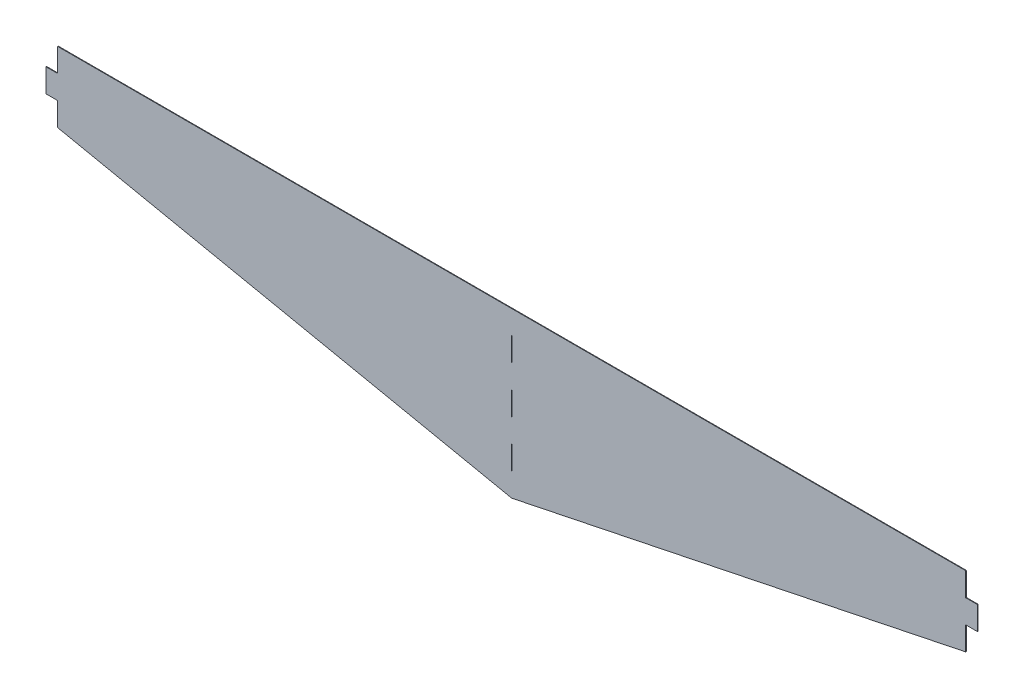
ISO-10303-21;
HEADER;
FILE_DESCRIPTION(('STEP AP214'),'2;1');
FILE_NAME('part.step','',(''),(''),'','','');
FILE_SCHEMA(('AUTOMOTIVE_DESIGN { 1 0 10303 214 1 1 1 1 }'));
ENDSEC;
DATA;
#1=APPLICATION_CONTEXT('core data for automotive mechanical design processes');
#2=APPLICATION_PROTOCOL_DEFINITION('international standard','automotive_design',2000,#1);
#3=PRODUCT_CONTEXT('',#1,'mechanical');
#4=PRODUCT('Part','Part','',(#3));
#5=PRODUCT_RELATED_PRODUCT_CATEGORY('part','',(#4));
#6=PRODUCT_DEFINITION_FORMATION('','',#4);
#7=PRODUCT_DEFINITION_CONTEXT('part definition',#1,'design');
#8=PRODUCT_DEFINITION('design','',#6,#7);
#9=PRODUCT_DEFINITION_SHAPE('','',#8);
#10=(LENGTH_UNIT() NAMED_UNIT(*) SI_UNIT(.MILLI.,.METRE.));
#11=(NAMED_UNIT(*) PLANE_ANGLE_UNIT() SI_UNIT($,.RADIAN.));
#12=(NAMED_UNIT(*) SI_UNIT($,.STERADIAN.) SOLID_ANGLE_UNIT());
#13=UNCERTAINTY_MEASURE_WITH_UNIT(LENGTH_MEASURE(1.E-05),#10,'distance_accuracy_value','');
#14=(GEOMETRIC_REPRESENTATION_CONTEXT(3) GLOBAL_UNCERTAINTY_ASSIGNED_CONTEXT((#13)) GLOBAL_UNIT_ASSIGNED_CONTEXT((#10,
#11,#12)) REPRESENTATION_CONTEXT('',''));
#15=CARTESIAN_POINT('',(0.,0.,0.));
#16=DIRECTION('',(0.,0.,1.));
#17=DIRECTION('',(1.,0.,0.));
#18=AXIS2_PLACEMENT_3D('',#15,#16,#17);
#19=CARTESIAN_POINT('',(-198.5,40.,0.125));
#20=DIRECTION('',(1.,0.,0.));
#21=DIRECTION('',(0.,0.,-1.));
#22=AXIS2_PLACEMENT_3D('',#19,#20,#21);
#23=PLANE('',#22);
#24=DIRECTION('',(0.,-1.,0.));
#25=VECTOR('',#24,1.);
#26=CARTESIAN_POINT('',(-198.5,40.,-0.125));
#27=LINE('',#26,#25);
#28=CARTESIAN_POINT('',(-198.5,60.,-0.125));
#29=VERTEX_POINT('',#28);
#30=CARTESIAN_POINT('',(-198.5,50.,-0.125));
#31=VERTEX_POINT('',#30);
#32=EDGE_CURVE('E219',#29,#31,#27,.T.);
#33=ORIENTED_EDGE('',*,*,#32,.T.);
#34=DIRECTION('',(0.,0.,1.));
#35=VECTOR('',#34,1.);
#36=CARTESIAN_POINT('',(-198.5,50.,-0.125));
#37=LINE('',#36,#35);
#38=CARTESIAN_POINT('',(-198.5,50.,0.125));
#39=VERTEX_POINT('',#38);
#40=EDGE_CURVE('E381',#31,#39,#37,.T.);
#41=ORIENTED_EDGE('',*,*,#40,.T.);
#42=DIRECTION('',(0.,-1.,0.));
#43=VECTOR('',#42,1.);
#44=CARTESIAN_POINT('',(-198.5,40.,0.125));
#45=LINE('',#44,#43);
#46=CARTESIAN_POINT('',(-198.5,60.,0.125));
#47=VERTEX_POINT('',#46);
#48=EDGE_CURVE('E231',#47,#39,#45,.T.);
#49=ORIENTED_EDGE('',*,*,#48,.F.);
#50=DIRECTION('',(0.,0.,1.));
#51=VECTOR('',#50,1.);
#52=CARTESIAN_POINT('',(-198.5,60.,-0.125));
#53=LINE('',#52,#51);
#54=EDGE_CURVE('E278',#29,#47,#53,.T.);
#55=ORIENTED_EDGE('',*,*,#54,.F.);
#56=EDGE_LOOP('',(#33,#41,#49,#55));
#57=FACE_BOUND('',#56,.T.);
#58=ADVANCED_FACE('F33',(#57),#23,.F.);
#59=CARTESIAN_POINT('',(0.,0.,0.125));
#60=DIRECTION('',(0.202438249047063,0.979295029765167,0.));
#61=DIRECTION('',(-0.979295029765167,0.202438249047063,0.));
#62=AXIS2_PLACEMENT_3D('',#59,#60,#61);
#63=PLANE('',#62);
#64=DIRECTION('',(0.979295029765167,-0.202438249047063,0.));
#65=VECTOR('',#64,1.);
#66=CARTESIAN_POINT('',(0.,0.,-0.125));
#67=LINE('',#66,#65);
#68=CARTESIAN_POINT('',(-193.5,40.,-0.125));
#69=VERTEX_POINT('',#68);
#70=CARTESIAN_POINT('',(0.,0.,-0.125));
#71=VERTEX_POINT('',#70);
#72=EDGE_CURVE('E211',#69,#71,#67,.T.);
#73=ORIENTED_EDGE('',*,*,#72,.T.);
#74=DIRECTION('',(0.,0.,-1.));
#75=VECTOR('',#74,1.);
#76=CARTESIAN_POINT('',(0.,0.,0.125));
#77=LINE('',#76,#75);
#78=CARTESIAN_POINT('',(0.,0.,0.125));
#79=VERTEX_POINT('',#78);
#80=EDGE_CURVE('E40',#79,#71,#77,.T.);
#81=ORIENTED_EDGE('',*,*,#80,.F.);
#82=DIRECTION('',(0.979295029765167,-0.202438249047063,0.));
#83=VECTOR('',#82,1.);
#84=CARTESIAN_POINT('',(0.,0.,0.125));
#85=LINE('',#84,#83);
#86=CARTESIAN_POINT('',(-193.5,40.,0.125));
#87=VERTEX_POINT('',#86);
#88=EDGE_CURVE('E213',#87,#79,#85,.T.);
#89=ORIENTED_EDGE('',*,*,#88,.F.);
#90=DIRECTION('',(0.,0.,-1.));
#91=VECTOR('',#90,1.);
#92=CARTESIAN_POINT('',(-193.5,40.,0.125));
#93=LINE('',#92,#91);
#94=EDGE_CURVE('E11',#87,#69,#93,.T.);
#95=ORIENTED_EDGE('',*,*,#94,.T.);
#96=EDGE_LOOP('',(#73,#81,#89,#95));
#97=FACE_BOUND('',#96,.T.);
#98=ADVANCED_FACE('F209',(#97),#63,.F.);
#99=CARTESIAN_POINT('',(0.,0.,0.125));
#100=DIRECTION('',(-0.202438249047063,0.979295029765167,0.));
#101=DIRECTION('',(-0.979295029765167,-0.202438249047063,0.));
#102=AXIS2_PLACEMENT_3D('',#99,#100,#101);
#103=PLANE('',#102);
#104=DIRECTION('',(0.979295029765167,0.202438249047063,0.));
#105=VECTOR('',#104,1.);
#106=CARTESIAN_POINT('',(0.,0.,-0.125));
#107=LINE('',#106,#105);
#108=CARTESIAN_POINT('',(193.5,40.,-0.125));
#109=VERTEX_POINT('',#108);
#110=EDGE_CURVE('E218',#71,#109,#107,.T.);
#111=ORIENTED_EDGE('',*,*,#110,.T.);
#112=DIRECTION('',(0.,0.,-1.));
#113=VECTOR('',#112,1.);
#114=CARTESIAN_POINT('',(193.5,40.,0.125));
#115=LINE('',#114,#113);
#116=CARTESIAN_POINT('',(193.5,40.,0.125));
#117=VERTEX_POINT('',#116);
#118=EDGE_CURVE('E232',#117,#109,#115,.T.);
#119=ORIENTED_EDGE('',*,*,#118,.F.);
#120=DIRECTION('',(0.979295029765167,0.202438249047063,0.));
#121=VECTOR('',#120,1.);
#122=CARTESIAN_POINT('',(0.,0.,0.125));
#123=LINE('',#122,#121);
#124=EDGE_CURVE('E239',#79,#117,#123,.T.);
#125=ORIENTED_EDGE('',*,*,#124,.F.);
#126=ORIENTED_EDGE('',*,*,#80,.T.);
#127=EDGE_LOOP('',(#111,#119,#125,#126));
#128=FACE_BOUND('',#127,.T.);
#129=ADVANCED_FACE('F236',(#128),#103,.F.);
#130=CARTESIAN_POINT('',(198.5,40.,0.125));
#131=DIRECTION('',(-1.,0.,0.));
#132=DIRECTION('',(0.,0.,1.));
#133=AXIS2_PLACEMENT_3D('',#130,#131,#132);
#134=PLANE('',#133);
#135=DIRECTION('',(0.,1.,0.));
#136=VECTOR('',#135,1.);
#137=CARTESIAN_POINT('',(198.5,40.,0.125));
#138=LINE('',#137,#136);
#139=CARTESIAN_POINT('',(198.5,50.,0.125));
#140=VERTEX_POINT('',#139);
#141=CARTESIAN_POINT('',(198.5,60.,0.125));
#142=VERTEX_POINT('',#141);
#143=EDGE_CURVE('E242',#140,#142,#138,.T.);
#144=ORIENTED_EDGE('',*,*,#143,.F.);
#145=DIRECTION('',(0.,0.,1.));
#146=VECTOR('',#145,1.);
#147=CARTESIAN_POINT('',(198.5,50.,-0.125));
#148=LINE('',#147,#146);
#149=CARTESIAN_POINT('',(198.5,50.,-0.125));
#150=VERTEX_POINT('',#149);
#151=EDGE_CURVE('E394',#150,#140,#148,.T.);
#152=ORIENTED_EDGE('',*,*,#151,.F.);
#153=DIRECTION('',(0.,1.,0.));
#154=VECTOR('',#153,1.);
#155=CARTESIAN_POINT('',(198.5,40.,-0.125));
#156=LINE('',#155,#154);
#157=CARTESIAN_POINT('',(198.5,60.,-0.125));
#158=VERTEX_POINT('',#157);
#159=EDGE_CURVE('E221',#150,#158,#156,.T.);
#160=ORIENTED_EDGE('',*,*,#159,.T.);
#161=DIRECTION('',(0.,0.,1.));
#162=VECTOR('',#161,1.);
#163=CARTESIAN_POINT('',(198.5,60.,-0.125));
#164=LINE('',#163,#162);
#165=EDGE_CURVE('E414',#158,#142,#164,.T.);
#166=ORIENTED_EDGE('',*,*,#165,.T.);
#167=EDGE_LOOP('',(#144,#152,#160,#166));
#168=FACE_BOUND('',#167,.T.);
#169=ADVANCED_FACE('F442',(#168),#134,.F.);
#170=CARTESIAN_POINT('',(-198.5,70.,0.125));
#171=DIRECTION('',(0.,-1.,0.));
#172=DIRECTION('',(1.,0.,0.));
#173=AXIS2_PLACEMENT_3D('',#170,#171,#172);
#174=PLANE('',#173);
#175=DIRECTION('',(-1.,0.,0.));
#176=VECTOR('',#175,1.);
#177=CARTESIAN_POINT('',(198.5,70.,0.125));
#178=LINE('',#177,#176);
#179=CARTESIAN_POINT('',(193.5,70.,0.125));
#180=VERTEX_POINT('',#179);
#181=CARTESIAN_POINT('',(-193.5,70.,0.125));
#182=VERTEX_POINT('',#181);
#183=EDGE_CURVE('E233',#180,#182,#178,.T.);
#184=ORIENTED_EDGE('',*,*,#183,.F.);
#185=DIRECTION('',(0.,0.,1.));
#186=VECTOR('',#185,1.);
#187=CARTESIAN_POINT('',(193.5,70.,-0.125));
#188=LINE('',#187,#186);
#189=CARTESIAN_POINT('',(193.5,70.,-0.125));
#190=VERTEX_POINT('',#189);
#191=EDGE_CURVE('E412',#190,#180,#188,.T.);
#192=ORIENTED_EDGE('',*,*,#191,.F.);
#193=DIRECTION('',(-1.,0.,0.));
#194=VECTOR('',#193,1.);
#195=CARTESIAN_POINT('',(-198.5,70.,-0.125));
#196=LINE('',#195,#194);
#197=CARTESIAN_POINT('',(-193.5,70.,-0.125));
#198=VERTEX_POINT('',#197);
#199=EDGE_CURVE('E229',#190,#198,#196,.T.);
#200=ORIENTED_EDGE('',*,*,#199,.T.);
#201=DIRECTION('',(0.,0.,1.));
#202=VECTOR('',#201,1.);
#203=CARTESIAN_POINT('',(-193.5,70.,-0.125));
#204=LINE('',#203,#202);
#205=EDGE_CURVE('E264',#198,#182,#204,.T.);
#206=ORIENTED_EDGE('',*,*,#205,.T.);
#207=EDGE_LOOP('',(#184,#192,#200,#206));
#208=FACE_BOUND('',#207,.T.);
#209=ADVANCED_FACE('F272',(#208),#174,.F.);
#210=CARTESIAN_POINT('',(0.,0.,0.125));
#211=DIRECTION('',(0.,0.,-1.));
#212=DIRECTION('',(-1.,0.,0.));
#213=AXIS2_PLACEMENT_3D('',#210,#211,#212);
#214=PLANE('',#213);
#215=DIRECTION('',(-1.,0.,0.));
#216=VECTOR('',#215,1.);
#217=CARTESIAN_POINT('',(-0.149999999999997,20.,0.125));
#218=LINE('',#217,#216);
#219=CARTESIAN_POINT('',(0.150000000000003,20.,0.125));
#220=VERTEX_POINT('',#219);
#221=CARTESIAN_POINT('',(-0.149999999999997,20.,0.125));
#222=VERTEX_POINT('',#221);
#223=EDGE_CURVE('E276',#220,#222,#218,.T.);
#224=ORIENTED_EDGE('',*,*,#223,.F.);
#225=DIRECTION('',(0.,1.,0.));
#226=VECTOR('',#225,1.);
#227=CARTESIAN_POINT('',(0.150000000000003,20.,0.125));
#228=LINE('',#227,#226);
#229=CARTESIAN_POINT('',(0.150000000000004,10.,0.125));
#230=VERTEX_POINT('',#229);
#231=EDGE_CURVE('E274',#230,#220,#228,.T.);
#232=ORIENTED_EDGE('',*,*,#231,.F.);
#233=DIRECTION('',(1.,0.,0.));
#234=VECTOR('',#233,1.);
#235=CARTESIAN_POINT('',(-0.149999999999996,10.,0.125));
#236=LINE('',#235,#234);
#237=CARTESIAN_POINT('',(-0.149999999999996,10.,0.125));
#238=VERTEX_POINT('',#237);
#239=EDGE_CURVE('E288',#238,#230,#236,.T.);
#240=ORIENTED_EDGE('',*,*,#239,.F.);
#241=DIRECTION('',(0.,-1.,0.));
#242=VECTOR('',#241,1.);
#243=CARTESIAN_POINT('',(-0.149999999999997,20.,0.125));
#244=LINE('',#243,#242);
#245=EDGE_CURVE('E300',#222,#238,#244,.T.);
#246=ORIENTED_EDGE('',*,*,#245,.F.);
#247=EDGE_LOOP('',(#224,#232,#240,#246));
#248=FACE_BOUND('',#247,.T.);
#249=DIRECTION('',(-1.,0.,0.));
#250=VECTOR('',#249,1.);
#251=CARTESIAN_POINT('',(-0.15,40.,0.125));
#252=LINE('',#251,#250);
#253=CARTESIAN_POINT('',(0.15,40.,0.125));
#254=VERTEX_POINT('',#253);
#255=CARTESIAN_POINT('',(-0.15,40.,0.125));
#256=VERTEX_POINT('',#255);
#257=EDGE_CURVE('E329',#254,#256,#252,.T.);
#258=ORIENTED_EDGE('',*,*,#257,.F.);
#259=DIRECTION('',(0.,1.,0.));
#260=VECTOR('',#259,1.);
#261=CARTESIAN_POINT('',(0.15,40.,0.125));
#262=LINE('',#261,#260);
#263=CARTESIAN_POINT('',(0.150000000000002,30.,0.125));
#264=VERTEX_POINT('',#263);
#265=EDGE_CURVE('E307',#264,#254,#262,.T.);
#266=ORIENTED_EDGE('',*,*,#265,.F.);
#267=DIRECTION('',(1.,0.,0.));
#268=VECTOR('',#267,1.);
#269=CARTESIAN_POINT('',(-0.149999999999998,30.,0.125));
#270=LINE('',#269,#268);
#271=CARTESIAN_POINT('',(-0.149999999999998,30.,0.125));
#272=VERTEX_POINT('',#271);
#273=EDGE_CURVE('E318',#272,#264,#270,.T.);
#274=ORIENTED_EDGE('',*,*,#273,.F.);
#275=DIRECTION('',(0.,-1.,0.));
#276=VECTOR('',#275,1.);
#277=CARTESIAN_POINT('',(-0.15,40.,0.125));
#278=LINE('',#277,#276);
#279=EDGE_CURVE('E332',#256,#272,#278,.T.);
#280=ORIENTED_EDGE('',*,*,#279,.F.);
#281=EDGE_LOOP('',(#258,#266,#274,#280));
#282=FACE_BOUND('',#281,.T.);
#283=DIRECTION('',(-1.,0.,0.));
#284=VECTOR('',#283,1.);
#285=CARTESIAN_POINT('',(-0.150000000000002,60.,0.125));
#286=LINE('',#285,#284);
#287=CARTESIAN_POINT('',(0.149999999999998,60.,0.125));
#288=VERTEX_POINT('',#287);
#289=CARTESIAN_POINT('',(-0.150000000000002,60.,0.125));
#290=VERTEX_POINT('',#289);
#291=EDGE_CURVE('E361',#288,#290,#286,.T.);
#292=ORIENTED_EDGE('',*,*,#291,.F.);
#293=DIRECTION('',(0.,1.,0.));
#294=VECTOR('',#293,1.);
#295=CARTESIAN_POINT('',(0.149999999999998,60.,0.125));
#296=LINE('',#295,#294);
#297=CARTESIAN_POINT('',(0.149999999999999,50.,0.125));
#298=VERTEX_POINT('',#297);
#299=EDGE_CURVE('E339',#298,#288,#296,.T.);
#300=ORIENTED_EDGE('',*,*,#299,.F.);
#301=DIRECTION('',(1.,0.,0.));
#302=VECTOR('',#301,1.);
#303=CARTESIAN_POINT('',(-0.150000000000001,50.,0.125));
#304=LINE('',#303,#302);
#305=CARTESIAN_POINT('',(-0.150000000000001,50.,0.125));
#306=VERTEX_POINT('',#305);
#307=EDGE_CURVE('E350',#306,#298,#304,.T.);
#308=ORIENTED_EDGE('',*,*,#307,.F.);
#309=DIRECTION('',(0.,-1.,0.));
#310=VECTOR('',#309,1.);
#311=CARTESIAN_POINT('',(-0.150000000000002,60.,0.125));
#312=LINE('',#311,#310);
#313=EDGE_CURVE('E364',#290,#306,#312,.T.);
#314=ORIENTED_EDGE('',*,*,#313,.F.);
#315=EDGE_LOOP('',(#292,#300,#308,#314));
#316=FACE_BOUND('',#315,.T.);
#317=ORIENTED_EDGE('',*,*,#48,.T.);
#318=DIRECTION('',(-1.,0.,0.));
#319=VECTOR('',#318,1.);
#320=CARTESIAN_POINT('',(-198.5,50.,0.125));
#321=LINE('',#320,#319);
#322=CARTESIAN_POINT('',(-193.5,50.,0.125));
#323=VERTEX_POINT('',#322);
#324=EDGE_CURVE('E205',#323,#39,#321,.T.);
#325=ORIENTED_EDGE('',*,*,#324,.F.);
#326=DIRECTION('',(0.,1.,0.));
#327=VECTOR('',#326,1.);
#328=CARTESIAN_POINT('',(-193.5,50.,0.125));
#329=LINE('',#328,#327);
#330=EDGE_CURVE('E401',#87,#323,#329,.T.);
#331=ORIENTED_EDGE('',*,*,#330,.F.);
#332=ORIENTED_EDGE('',*,*,#88,.T.);
#333=ORIENTED_EDGE('',*,*,#124,.T.);
#334=DIRECTION('',(0.,-1.,0.));
#335=VECTOR('',#334,1.);
#336=CARTESIAN_POINT('',(193.5,50.,0.125));
#337=LINE('',#336,#335);
#338=CARTESIAN_POINT('',(193.5,50.,0.125));
#339=VERTEX_POINT('',#338);
#340=EDGE_CURVE('E395',#339,#117,#337,.T.);
#341=ORIENTED_EDGE('',*,*,#340,.F.);
#342=DIRECTION('',(-1.,0.,0.));
#343=VECTOR('',#342,1.);
#344=CARTESIAN_POINT('',(193.5,50.,0.125));
#345=LINE('',#344,#343);
#346=EDGE_CURVE('E391',#140,#339,#345,.T.);
#347=ORIENTED_EDGE('',*,*,#346,.F.);
#348=ORIENTED_EDGE('',*,*,#143,.T.);
#349=DIRECTION('',(1.,0.,0.));
#350=VECTOR('',#349,1.);
#351=CARTESIAN_POINT('',(193.5,60.,0.125));
#352=LINE('',#351,#350);
#353=CARTESIAN_POINT('',(193.5,60.,0.125));
#354=VERTEX_POINT('',#353);
#355=EDGE_CURVE('E383',#354,#142,#352,.T.);
#356=ORIENTED_EDGE('',*,*,#355,.F.);
#357=DIRECTION('',(0.,-1.,0.));
#358=VECTOR('',#357,1.);
#359=CARTESIAN_POINT('',(193.5,70.,0.125));
#360=LINE('',#359,#358);
#361=EDGE_CURVE('E257',#180,#354,#360,.T.);
#362=ORIENTED_EDGE('',*,*,#361,.F.);
#363=ORIENTED_EDGE('',*,*,#183,.T.);
#364=DIRECTION('',(0.,1.,0.));
#365=VECTOR('',#364,1.);
#366=CARTESIAN_POINT('',(-193.5,70.,0.125));
#367=LINE('',#366,#365);
#368=CARTESIAN_POINT('',(-193.5,60.,0.125));
#369=VERTEX_POINT('',#368);
#370=EDGE_CURVE('E254',#369,#182,#367,.T.);
#371=ORIENTED_EDGE('',*,*,#370,.F.);
#372=DIRECTION('',(1.,0.,0.));
#373=VECTOR('',#372,1.);
#374=CARTESIAN_POINT('',(-198.5,60.,0.125));
#375=LINE('',#374,#373);
#376=EDGE_CURVE('E270',#47,#369,#375,.T.);
#377=ORIENTED_EDGE('',*,*,#376,.F.);
#378=EDGE_LOOP('',(#317,#325,#331,#332,#333,#341,#347,#348,#356,#362,#363,#371,#377));
#379=FACE_BOUND('',#378,.T.);
#380=ADVANCED_FACE('F252',(#248,#282,#316,#379),#214,.F.);
#381=CARTESIAN_POINT('',(0.,0.,-0.125));
#382=DIRECTION('',(0.,0.,-1.));
#383=DIRECTION('',(-1.,0.,0.));
#384=AXIS2_PLACEMENT_3D('',#381,#382,#383);
#385=PLANE('',#384);
#386=DIRECTION('',(-1.,0.,0.));
#387=VECTOR('',#386,1.);
#388=CARTESIAN_POINT('',(-198.5,50.,-0.125));
#389=LINE('',#388,#387);
#390=CARTESIAN_POINT('',(-193.5,50.,-0.125));
#391=VERTEX_POINT('',#390);
#392=EDGE_CURVE('E47',#391,#31,#389,.T.);
#393=ORIENTED_EDGE('',*,*,#392,.T.);
#394=ORIENTED_EDGE('',*,*,#32,.F.);
#395=DIRECTION('',(1.,0.,0.));
#396=VECTOR('',#395,1.);
#397=CARTESIAN_POINT('',(-198.5,60.,-0.125));
#398=LINE('',#397,#396);
#399=CARTESIAN_POINT('',(-193.5,60.,-0.125));
#400=VERTEX_POINT('',#399);
#401=EDGE_CURVE('E269',#29,#400,#398,.T.);
#402=ORIENTED_EDGE('',*,*,#401,.T.);
#403=DIRECTION('',(0.,1.,0.));
#404=VECTOR('',#403,1.);
#405=CARTESIAN_POINT('',(-193.5,70.,-0.125));
#406=LINE('',#405,#404);
#407=EDGE_CURVE('E283',#400,#198,#406,.T.);
#408=ORIENTED_EDGE('',*,*,#407,.T.);
#409=ORIENTED_EDGE('',*,*,#199,.F.);
#410=DIRECTION('',(0.,-1.,0.));
#411=VECTOR('',#410,1.);
#412=CARTESIAN_POINT('',(193.5,70.,-0.125));
#413=LINE('',#412,#411);
#414=CARTESIAN_POINT('',(193.5,60.,-0.125));
#415=VERTEX_POINT('',#414);
#416=EDGE_CURVE('E403',#190,#415,#413,.T.);
#417=ORIENTED_EDGE('',*,*,#416,.T.);
#418=DIRECTION('',(1.,0.,0.));
#419=VECTOR('',#418,1.);
#420=CARTESIAN_POINT('',(193.5,60.,-0.125));
#421=LINE('',#420,#419);
#422=EDGE_CURVE('E406',#415,#158,#421,.T.);
#423=ORIENTED_EDGE('',*,*,#422,.T.);
#424=ORIENTED_EDGE('',*,*,#159,.F.);
#425=DIRECTION('',(-1.,0.,0.));
#426=VECTOR('',#425,1.);
#427=CARTESIAN_POINT('',(193.5,50.,-0.125));
#428=LINE('',#427,#426);
#429=CARTESIAN_POINT('',(193.5,50.,-0.125));
#430=VERTEX_POINT('',#429);
#431=EDGE_CURVE('E390',#150,#430,#428,.T.);
#432=ORIENTED_EDGE('',*,*,#431,.T.);
#433=DIRECTION('',(0.,-1.,0.));
#434=VECTOR('',#433,1.);
#435=CARTESIAN_POINT('',(193.5,50.,-0.125));
#436=LINE('',#435,#434);
#437=EDGE_CURVE('E55',#430,#109,#436,.T.);
#438=ORIENTED_EDGE('',*,*,#437,.T.);
#439=ORIENTED_EDGE('',*,*,#110,.F.);
#440=ORIENTED_EDGE('',*,*,#72,.F.);
#441=DIRECTION('',(0.,1.,0.));
#442=VECTOR('',#441,1.);
#443=CARTESIAN_POINT('',(-193.5,50.,-0.125));
#444=LINE('',#443,#442);
#445=EDGE_CURVE('E198',#69,#391,#444,.T.);
#446=ORIENTED_EDGE('',*,*,#445,.T.);
#447=EDGE_LOOP('',(#393,#394,#402,#408,#409,#417,#423,#424,#432,#438,#439,#440,#446));
#448=FACE_BOUND('',#447,.T.);
#449=DIRECTION('',(0.,1.,0.));
#450=VECTOR('',#449,1.);
#451=CARTESIAN_POINT('',(0.150000000000003,20.,-0.125));
#452=LINE('',#451,#450);
#453=CARTESIAN_POINT('',(0.150000000000004,10.,-0.125));
#454=VERTEX_POINT('',#453);
#455=CARTESIAN_POINT('',(0.150000000000003,20.,-0.125));
#456=VERTEX_POINT('',#455);
#457=EDGE_CURVE('E284',#454,#456,#452,.T.);
#458=ORIENTED_EDGE('',*,*,#457,.T.);
#459=DIRECTION('',(-1.,0.,0.));
#460=VECTOR('',#459,1.);
#461=CARTESIAN_POINT('',(-0.149999999999997,20.,-0.125));
#462=LINE('',#461,#460);
#463=CARTESIAN_POINT('',(-0.149999999999997,20.,-0.125));
#464=VERTEX_POINT('',#463);
#465=EDGE_CURVE('E287',#456,#464,#462,.T.);
#466=ORIENTED_EDGE('',*,*,#465,.T.);
#467=DIRECTION('',(0.,-1.,0.));
#468=VECTOR('',#467,1.);
#469=CARTESIAN_POINT('',(-0.149999999999997,20.,-0.125));
#470=LINE('',#469,#468);
#471=CARTESIAN_POINT('',(-0.149999999999996,10.,-0.125));
#472=VERTEX_POINT('',#471);
#473=EDGE_CURVE('E291',#464,#472,#470,.T.);
#474=ORIENTED_EDGE('',*,*,#473,.T.);
#475=DIRECTION('',(1.,0.,0.));
#476=VECTOR('',#475,1.);
#477=CARTESIAN_POINT('',(-0.149999999999996,10.,-0.125));
#478=LINE('',#477,#476);
#479=EDGE_CURVE('E294',#472,#454,#478,.T.);
#480=ORIENTED_EDGE('',*,*,#479,.T.);
#481=EDGE_LOOP('',(#458,#466,#474,#480));
#482=FACE_BOUND('',#481,.T.);
#483=DIRECTION('',(0.,1.,0.));
#484=VECTOR('',#483,1.);
#485=CARTESIAN_POINT('',(0.15,40.,-0.125));
#486=LINE('',#485,#484);
#487=CARTESIAN_POINT('',(0.150000000000002,30.,-0.125));
#488=VERTEX_POINT('',#487);
#489=CARTESIAN_POINT('',(0.15,40.,-0.125));
#490=VERTEX_POINT('',#489);
#491=EDGE_CURVE('E314',#488,#490,#486,.T.);
#492=ORIENTED_EDGE('',*,*,#491,.T.);
#493=DIRECTION('',(-1.,0.,0.));
#494=VECTOR('',#493,1.);
#495=CARTESIAN_POINT('',(-0.15,40.,-0.125));
#496=LINE('',#495,#494);
#497=CARTESIAN_POINT('',(-0.15,40.,-0.125));
#498=VERTEX_POINT('',#497);
#499=EDGE_CURVE('E317',#490,#498,#496,.T.);
#500=ORIENTED_EDGE('',*,*,#499,.T.);
#501=DIRECTION('',(0.,-1.,0.));
#502=VECTOR('',#501,1.);
#503=CARTESIAN_POINT('',(-0.15,40.,-0.125));
#504=LINE('',#503,#502);
#505=CARTESIAN_POINT('',(-0.149999999999998,30.,-0.125));
#506=VERTEX_POINT('',#505);
#507=EDGE_CURVE('E321',#498,#506,#504,.T.);
#508=ORIENTED_EDGE('',*,*,#507,.T.);
#509=DIRECTION('',(1.,0.,0.));
#510=VECTOR('',#509,1.);
#511=CARTESIAN_POINT('',(-0.149999999999998,30.,-0.125));
#512=LINE('',#511,#510);
#513=EDGE_CURVE('E324',#506,#488,#512,.T.);
#514=ORIENTED_EDGE('',*,*,#513,.T.);
#515=EDGE_LOOP('',(#492,#500,#508,#514));
#516=FACE_BOUND('',#515,.T.);
#517=DIRECTION('',(0.,1.,0.));
#518=VECTOR('',#517,1.);
#519=CARTESIAN_POINT('',(0.149999999999998,60.,-0.125));
#520=LINE('',#519,#518);
#521=CARTESIAN_POINT('',(0.149999999999999,50.,-0.125));
#522=VERTEX_POINT('',#521);
#523=CARTESIAN_POINT('',(0.149999999999998,60.,-0.125));
#524=VERTEX_POINT('',#523);
#525=EDGE_CURVE('E346',#522,#524,#520,.T.);
#526=ORIENTED_EDGE('',*,*,#525,.T.);
#527=DIRECTION('',(-1.,0.,0.));
#528=VECTOR('',#527,1.);
#529=CARTESIAN_POINT('',(-0.150000000000002,60.,-0.125));
#530=LINE('',#529,#528);
#531=CARTESIAN_POINT('',(-0.150000000000002,60.,-0.125));
#532=VERTEX_POINT('',#531);
#533=EDGE_CURVE('E349',#524,#532,#530,.T.);
#534=ORIENTED_EDGE('',*,*,#533,.T.);
#535=DIRECTION('',(0.,-1.,0.));
#536=VECTOR('',#535,1.);
#537=CARTESIAN_POINT('',(-0.150000000000002,60.,-0.125));
#538=LINE('',#537,#536);
#539=CARTESIAN_POINT('',(-0.150000000000001,50.,-0.125));
#540=VERTEX_POINT('',#539);
#541=EDGE_CURVE('E353',#532,#540,#538,.T.);
#542=ORIENTED_EDGE('',*,*,#541,.T.);
#543=DIRECTION('',(1.,0.,0.));
#544=VECTOR('',#543,1.);
#545=CARTESIAN_POINT('',(-0.150000000000001,50.,-0.125));
#546=LINE('',#545,#544);
#547=EDGE_CURVE('E356',#540,#522,#546,.T.);
#548=ORIENTED_EDGE('',*,*,#547,.T.);
#549=EDGE_LOOP('',(#526,#534,#542,#548));
#550=FACE_BOUND('',#549,.T.);
#551=ADVANCED_FACE('F215',(#448,#482,#516,#550),#385,.T.);
#552=CARTESIAN_POINT('',(0.149999999999998,60.,-0.125));
#553=DIRECTION('',(1.,0.,0.));
#554=DIRECTION('',(0.,1.,0.));
#555=AXIS2_PLACEMENT_3D('',#552,#553,#554);
#556=PLANE('',#555);
#557=ORIENTED_EDGE('',*,*,#299,.T.);
#558=DIRECTION('',(0.,0.,1.));
#559=VECTOR('',#558,1.);
#560=CARTESIAN_POINT('',(0.149999999999998,60.,-0.125));
#561=LINE('',#560,#559);
#562=EDGE_CURVE('E359',#524,#288,#561,.T.);
#563=ORIENTED_EDGE('',*,*,#562,.F.);
#564=ORIENTED_EDGE('',*,*,#525,.F.);
#565=DIRECTION('',(0.,0.,1.));
#566=VECTOR('',#565,1.);
#567=CARTESIAN_POINT('',(0.149999999999999,50.,-0.125));
#568=LINE('',#567,#566);
#569=EDGE_CURVE('E224',#522,#298,#568,.T.);
#570=ORIENTED_EDGE('',*,*,#569,.T.);
#571=EDGE_LOOP('',(#557,#563,#564,#570));
#572=FACE_BOUND('',#571,.T.);
#573=ADVANCED_FACE('F452',(#572),#556,.F.);
#574=CARTESIAN_POINT('',(-0.150000000000001,50.,-0.125));
#575=DIRECTION('',(0.,-1.,0.));
#576=DIRECTION('',(0.,0.,-1.));
#577=AXIS2_PLACEMENT_3D('',#574,#575,#576);
#578=PLANE('',#577);
#579=ORIENTED_EDGE('',*,*,#307,.T.);
#580=ORIENTED_EDGE('',*,*,#569,.F.);
#581=ORIENTED_EDGE('',*,*,#547,.F.);
#582=DIRECTION('',(0.,0.,1.));
#583=VECTOR('',#582,1.);
#584=CARTESIAN_POINT('',(-0.150000000000001,50.,-0.125));
#585=LINE('',#584,#583);
#586=EDGE_CURVE('E370',#540,#306,#585,.T.);
#587=ORIENTED_EDGE('',*,*,#586,.T.);
#588=EDGE_LOOP('',(#579,#580,#581,#587));
#589=FACE_BOUND('',#588,.T.);
#590=ADVANCED_FACE('F458',(#589),#578,.F.);
#591=CARTESIAN_POINT('',(-0.150000000000002,60.,-0.125));
#592=DIRECTION('',(-1.,0.,0.));
#593=DIRECTION('',(0.,-1.,0.));
#594=AXIS2_PLACEMENT_3D('',#591,#592,#593);
#595=PLANE('',#594);
#596=ORIENTED_EDGE('',*,*,#313,.T.);
#597=ORIENTED_EDGE('',*,*,#586,.F.);
#598=ORIENTED_EDGE('',*,*,#541,.F.);
#599=DIRECTION('',(0.,0.,1.));
#600=VECTOR('',#599,1.);
#601=CARTESIAN_POINT('',(-0.150000000000002,60.,-0.125));
#602=LINE('',#601,#600);
#603=EDGE_CURVE('E372',#532,#290,#602,.T.);
#604=ORIENTED_EDGE('',*,*,#603,.T.);
#605=EDGE_LOOP('',(#596,#597,#598,#604));
#606=FACE_BOUND('',#605,.T.);
#607=ADVANCED_FACE('F464',(#606),#595,.F.);
#608=CARTESIAN_POINT('',(-0.150000000000002,60.,-0.125));
#609=DIRECTION('',(0.,1.,0.));
#610=DIRECTION('',(0.,0.,1.));
#611=AXIS2_PLACEMENT_3D('',#608,#609,#610);
#612=PLANE('',#611);
#613=ORIENTED_EDGE('',*,*,#291,.T.);
#614=ORIENTED_EDGE('',*,*,#603,.F.);
#615=ORIENTED_EDGE('',*,*,#533,.F.);
#616=ORIENTED_EDGE('',*,*,#562,.T.);
#617=EDGE_LOOP('',(#613,#614,#615,#616));
#618=FACE_BOUND('',#617,.T.);
#619=ADVANCED_FACE('F460',(#618),#612,.F.);
#620=CARTESIAN_POINT('',(0.15,40.,-0.125));
#621=DIRECTION('',(1.,0.,0.));
#622=DIRECTION('',(0.,1.,0.));
#623=AXIS2_PLACEMENT_3D('',#620,#621,#622);
#624=PLANE('',#623);
#625=ORIENTED_EDGE('',*,*,#265,.T.);
#626=DIRECTION('',(0.,0.,1.));
#627=VECTOR('',#626,1.);
#628=CARTESIAN_POINT('',(0.15,40.,-0.125));
#629=LINE('',#628,#627);
#630=EDGE_CURVE('E327',#490,#254,#629,.T.);
#631=ORIENTED_EDGE('',*,*,#630,.F.);
#632=ORIENTED_EDGE('',*,*,#491,.F.);
#633=DIRECTION('',(0.,0.,1.));
#634=VECTOR('',#633,1.);
#635=CARTESIAN_POINT('',(0.150000000000002,30.,-0.125));
#636=LINE('',#635,#634);
#637=EDGE_CURVE('E337',#488,#264,#636,.T.);
#638=ORIENTED_EDGE('',*,*,#637,.T.);
#639=EDGE_LOOP('',(#625,#631,#632,#638));
#640=FACE_BOUND('',#639,.T.);
#641=ADVANCED_FACE('F463',(#640),#624,.F.);
#642=CARTESIAN_POINT('',(-0.149999999999998,30.,-0.125));
#643=DIRECTION('',(0.,-1.,0.));
#644=DIRECTION('',(0.,0.,-1.));
#645=AXIS2_PLACEMENT_3D('',#642,#643,#644);
#646=PLANE('',#645);
#647=ORIENTED_EDGE('',*,*,#273,.T.);
#648=ORIENTED_EDGE('',*,*,#637,.F.);
#649=ORIENTED_EDGE('',*,*,#513,.F.);
#650=DIRECTION('',(0.,0.,1.));
#651=VECTOR('',#650,1.);
#652=CARTESIAN_POINT('',(-0.149999999999998,30.,-0.125));
#653=LINE('',#652,#651);
#654=EDGE_CURVE('E340',#506,#272,#653,.T.);
#655=ORIENTED_EDGE('',*,*,#654,.T.);
#656=EDGE_LOOP('',(#647,#648,#649,#655));
#657=FACE_BOUND('',#656,.T.);
#658=ADVANCED_FACE('F474',(#657),#646,.F.);
#659=CARTESIAN_POINT('',(-0.15,40.,-0.125));
#660=DIRECTION('',(-1.,0.,0.));
#661=DIRECTION('',(0.,-1.,0.));
#662=AXIS2_PLACEMENT_3D('',#659,#660,#661);
#663=PLANE('',#662);
#664=ORIENTED_EDGE('',*,*,#279,.T.);
#665=ORIENTED_EDGE('',*,*,#654,.F.);
#666=ORIENTED_EDGE('',*,*,#507,.F.);
#667=DIRECTION('',(0.,0.,1.));
#668=VECTOR('',#667,1.);
#669=CARTESIAN_POINT('',(-0.15,40.,-0.125));
#670=LINE('',#669,#668);
#671=EDGE_CURVE('E342',#498,#256,#670,.T.);
#672=ORIENTED_EDGE('',*,*,#671,.T.);
#673=EDGE_LOOP('',(#664,#665,#666,#672));
#674=FACE_BOUND('',#673,.T.);
#675=ADVANCED_FACE('F480',(#674),#663,.F.);
#676=CARTESIAN_POINT('',(-0.15,40.,-0.125));
#677=DIRECTION('',(0.,1.,0.));
#678=DIRECTION('',(0.,0.,1.));
#679=AXIS2_PLACEMENT_3D('',#676,#677,#678);
#680=PLANE('',#679);
#681=ORIENTED_EDGE('',*,*,#257,.T.);
#682=ORIENTED_EDGE('',*,*,#671,.F.);
#683=ORIENTED_EDGE('',*,*,#499,.F.);
#684=ORIENTED_EDGE('',*,*,#630,.T.);
#685=EDGE_LOOP('',(#681,#682,#683,#684));
#686=FACE_BOUND('',#685,.T.);
#687=ADVANCED_FACE('F476',(#686),#680,.F.);
#688=CARTESIAN_POINT('',(0.150000000000003,20.,-0.125));
#689=DIRECTION('',(1.,0.,0.));
#690=DIRECTION('',(0.,1.,0.));
#691=AXIS2_PLACEMENT_3D('',#688,#689,#690);
#692=PLANE('',#691);
#693=ORIENTED_EDGE('',*,*,#231,.T.);
#694=DIRECTION('',(0.,0.,1.));
#695=VECTOR('',#694,1.);
#696=CARTESIAN_POINT('',(0.150000000000003,20.,-0.125));
#697=LINE('',#696,#695);
#698=EDGE_CURVE('E296',#456,#220,#697,.T.);
#699=ORIENTED_EDGE('',*,*,#698,.F.);
#700=ORIENTED_EDGE('',*,*,#457,.F.);
#701=DIRECTION('',(0.,0.,1.));
#702=VECTOR('',#701,1.);
#703=CARTESIAN_POINT('',(0.150000000000004,10.,-0.125));
#704=LINE('',#703,#702);
#705=EDGE_CURVE('E305',#454,#230,#704,.T.);
#706=ORIENTED_EDGE('',*,*,#705,.T.);
#707=EDGE_LOOP('',(#693,#699,#700,#706));
#708=FACE_BOUND('',#707,.T.);
#709=ADVANCED_FACE('F479',(#708),#692,.F.);
#710=CARTESIAN_POINT('',(-0.149999999999996,10.,-0.125));
#711=DIRECTION('',(0.,-1.,0.));
#712=DIRECTION('',(0.,0.,-1.));
#713=AXIS2_PLACEMENT_3D('',#710,#711,#712);
#714=PLANE('',#713);
#715=ORIENTED_EDGE('',*,*,#239,.T.);
#716=ORIENTED_EDGE('',*,*,#705,.F.);
#717=ORIENTED_EDGE('',*,*,#479,.F.);
#718=DIRECTION('',(0.,0.,1.));
#719=VECTOR('',#718,1.);
#720=CARTESIAN_POINT('',(-0.149999999999996,10.,-0.125));
#721=LINE('',#720,#719);
#722=EDGE_CURVE('E308',#472,#238,#721,.T.);
#723=ORIENTED_EDGE('',*,*,#722,.T.);
#724=EDGE_LOOP('',(#715,#716,#717,#723));
#725=FACE_BOUND('',#724,.T.);
#726=ADVANCED_FACE('F490',(#725),#714,.F.);
#727=CARTESIAN_POINT('',(-0.149999999999997,20.,-0.125));
#728=DIRECTION('',(-1.,0.,0.));
#729=DIRECTION('',(0.,-1.,0.));
#730=AXIS2_PLACEMENT_3D('',#727,#728,#729);
#731=PLANE('',#730);
#732=ORIENTED_EDGE('',*,*,#245,.T.);
#733=ORIENTED_EDGE('',*,*,#722,.F.);
#734=ORIENTED_EDGE('',*,*,#473,.F.);
#735=DIRECTION('',(0.,0.,1.));
#736=VECTOR('',#735,1.);
#737=CARTESIAN_POINT('',(-0.149999999999997,20.,-0.125));
#738=LINE('',#737,#736);
#739=EDGE_CURVE('E310',#464,#222,#738,.T.);
#740=ORIENTED_EDGE('',*,*,#739,.T.);
#741=EDGE_LOOP('',(#732,#733,#734,#740));
#742=FACE_BOUND('',#741,.T.);
#743=ADVANCED_FACE('F495',(#742),#731,.F.);
#744=CARTESIAN_POINT('',(-0.149999999999997,20.,-0.125));
#745=DIRECTION('',(0.,1.,0.));
#746=DIRECTION('',(0.,0.,1.));
#747=AXIS2_PLACEMENT_3D('',#744,#745,#746);
#748=PLANE('',#747);
#749=ORIENTED_EDGE('',*,*,#223,.T.);
#750=ORIENTED_EDGE('',*,*,#739,.F.);
#751=ORIENTED_EDGE('',*,*,#465,.F.);
#752=ORIENTED_EDGE('',*,*,#698,.T.);
#753=EDGE_LOOP('',(#749,#750,#751,#752));
#754=FACE_BOUND('',#753,.T.);
#755=ADVANCED_FACE('F492',(#754),#748,.F.);
#756=CARTESIAN_POINT('',(-193.5,70.,-0.125));
#757=DIRECTION('',(1.,0.,0.));
#758=DIRECTION('',(0.,0.,-1.));
#759=AXIS2_PLACEMENT_3D('',#756,#757,#758);
#760=PLANE('',#759);
#761=ORIENTED_EDGE('',*,*,#370,.T.);
#762=ORIENTED_EDGE('',*,*,#205,.F.);
#763=ORIENTED_EDGE('',*,*,#407,.F.);
#764=DIRECTION('',(0.,0.,1.));
#765=VECTOR('',#764,1.);
#766=CARTESIAN_POINT('',(-193.5,60.,-0.125));
#767=LINE('',#766,#765);
#768=EDGE_CURVE('E267',#400,#369,#767,.T.);
#769=ORIENTED_EDGE('',*,*,#768,.T.);
#770=EDGE_LOOP('',(#761,#762,#763,#769));
#771=FACE_BOUND('',#770,.T.);
#772=ADVANCED_FACE('F263',(#771),#760,.F.);
#773=CARTESIAN_POINT('',(-198.5,60.,-0.125));
#774=DIRECTION('',(0.,-1.,0.));
#775=DIRECTION('',(0.,0.,-1.));
#776=AXIS2_PLACEMENT_3D('',#773,#774,#775);
#777=PLANE('',#776);
#778=ORIENTED_EDGE('',*,*,#376,.T.);
#779=ORIENTED_EDGE('',*,*,#768,.F.);
#780=ORIENTED_EDGE('',*,*,#401,.F.);
#781=ORIENTED_EDGE('',*,*,#54,.T.);
#782=EDGE_LOOP('',(#778,#779,#780,#781));
#783=FACE_BOUND('',#782,.T.);
#784=ADVANCED_FACE('F421',(#783),#777,.F.);
#785=CARTESIAN_POINT('',(193.5,70.,-0.125));
#786=DIRECTION('',(-1.,0.,0.));
#787=DIRECTION('',(0.,0.,1.));
#788=AXIS2_PLACEMENT_3D('',#785,#786,#787);
#789=PLANE('',#788);
#790=ORIENTED_EDGE('',*,*,#361,.T.);
#791=DIRECTION('',(0.,0.,1.));
#792=VECTOR('',#791,1.);
#793=CARTESIAN_POINT('',(193.5,60.,-0.125));
#794=LINE('',#793,#792);
#795=EDGE_CURVE('E408',#415,#354,#794,.T.);
#796=ORIENTED_EDGE('',*,*,#795,.F.);
#797=ORIENTED_EDGE('',*,*,#416,.F.);
#798=ORIENTED_EDGE('',*,*,#191,.T.);
#799=EDGE_LOOP('',(#790,#796,#797,#798));
#800=FACE_BOUND('',#799,.T.);
#801=ADVANCED_FACE('F505',(#800),#789,.F.);
#802=CARTESIAN_POINT('',(193.5,60.,-0.125));
#803=DIRECTION('',(0.,-1.,0.));
#804=DIRECTION('',(0.,0.,-1.));
#805=AXIS2_PLACEMENT_3D('',#802,#803,#804);
#806=PLANE('',#805);
#807=ORIENTED_EDGE('',*,*,#355,.T.);
#808=ORIENTED_EDGE('',*,*,#165,.F.);
#809=ORIENTED_EDGE('',*,*,#422,.F.);
#810=ORIENTED_EDGE('',*,*,#795,.T.);
#811=EDGE_LOOP('',(#807,#808,#809,#810));
#812=FACE_BOUND('',#811,.T.);
#813=ADVANCED_FACE('F510',(#812),#806,.F.);
#814=CARTESIAN_POINT('',(193.5,50.,-0.125));
#815=DIRECTION('',(-1.,0.,0.));
#816=DIRECTION('',(0.,0.,1.));
#817=AXIS2_PLACEMENT_3D('',#814,#815,#816);
#818=PLANE('',#817);
#819=ORIENTED_EDGE('',*,*,#340,.T.);
#820=ORIENTED_EDGE('',*,*,#118,.T.);
#821=ORIENTED_EDGE('',*,*,#437,.F.);
#822=DIRECTION('',(0.,0.,1.));
#823=VECTOR('',#822,1.);
#824=CARTESIAN_POINT('',(193.5,50.,-0.125));
#825=LINE('',#824,#823);
#826=EDGE_CURVE('E399',#430,#339,#825,.T.);
#827=ORIENTED_EDGE('',*,*,#826,.T.);
#828=EDGE_LOOP('',(#819,#820,#821,#827));
#829=FACE_BOUND('',#828,.T.);
#830=ADVANCED_FACE('F432',(#829),#818,.F.);
#831=CARTESIAN_POINT('',(193.5,50.,-0.125));
#832=DIRECTION('',(0.,1.,0.));
#833=DIRECTION('',(0.,0.,1.));
#834=AXIS2_PLACEMENT_3D('',#831,#832,#833);
#835=PLANE('',#834);
#836=ORIENTED_EDGE('',*,*,#346,.T.);
#837=ORIENTED_EDGE('',*,*,#826,.F.);
#838=ORIENTED_EDGE('',*,*,#431,.F.);
#839=ORIENTED_EDGE('',*,*,#151,.T.);
#840=EDGE_LOOP('',(#836,#837,#838,#839));
#841=FACE_BOUND('',#840,.T.);
#842=ADVANCED_FACE('F425',(#841),#835,.F.);
#843=CARTESIAN_POINT('',(-198.5,50.,-0.125));
#844=DIRECTION('',(0.,1.,0.));
#845=DIRECTION('',(0.,0.,1.));
#846=AXIS2_PLACEMENT_3D('',#843,#844,#845);
#847=PLANE('',#846);
#848=ORIENTED_EDGE('',*,*,#324,.T.);
#849=ORIENTED_EDGE('',*,*,#40,.F.);
#850=ORIENTED_EDGE('',*,*,#392,.F.);
#851=DIRECTION('',(0.,0.,1.));
#852=VECTOR('',#851,1.);
#853=CARTESIAN_POINT('',(-193.5,50.,-0.125));
#854=LINE('',#853,#852);
#855=EDGE_CURVE('E202',#391,#323,#854,.T.);
#856=ORIENTED_EDGE('',*,*,#855,.T.);
#857=EDGE_LOOP('',(#848,#849,#850,#856));
#858=FACE_BOUND('',#857,.T.);
#859=ADVANCED_FACE('F423',(#858),#847,.F.);
#860=CARTESIAN_POINT('',(-193.5,50.,-0.125));
#861=DIRECTION('',(1.,0.,0.));
#862=DIRECTION('',(0.,0.,-1.));
#863=AXIS2_PLACEMENT_3D('',#860,#861,#862);
#864=PLANE('',#863);
#865=ORIENTED_EDGE('',*,*,#330,.T.);
#866=ORIENTED_EDGE('',*,*,#855,.F.);
#867=ORIENTED_EDGE('',*,*,#445,.F.);
#868=ORIENTED_EDGE('',*,*,#94,.F.);
#869=EDGE_LOOP('',(#865,#866,#867,#868));
#870=FACE_BOUND('',#869,.T.);
#871=ADVANCED_FACE('F200',(#870),#864,.F.);
#872=CLOSED_SHELL('',(#58,#98,#129,#169,#209,#380,#551,#573,#590,#607,#619,#641,#658,#675,#687,
#709,#726,#743,#755,#772,#784,#801,#813,#830,#842,#859,#871));
#873=MANIFOLD_SOLID_BREP('B2',#872);
#874=ADVANCED_BREP_SHAPE_REPRESENTATION('',(#18,#873),#14);
#875=SHAPE_DEFINITION_REPRESENTATION(#9,#874);
ENDSEC;
END-ISO-10303-21;
